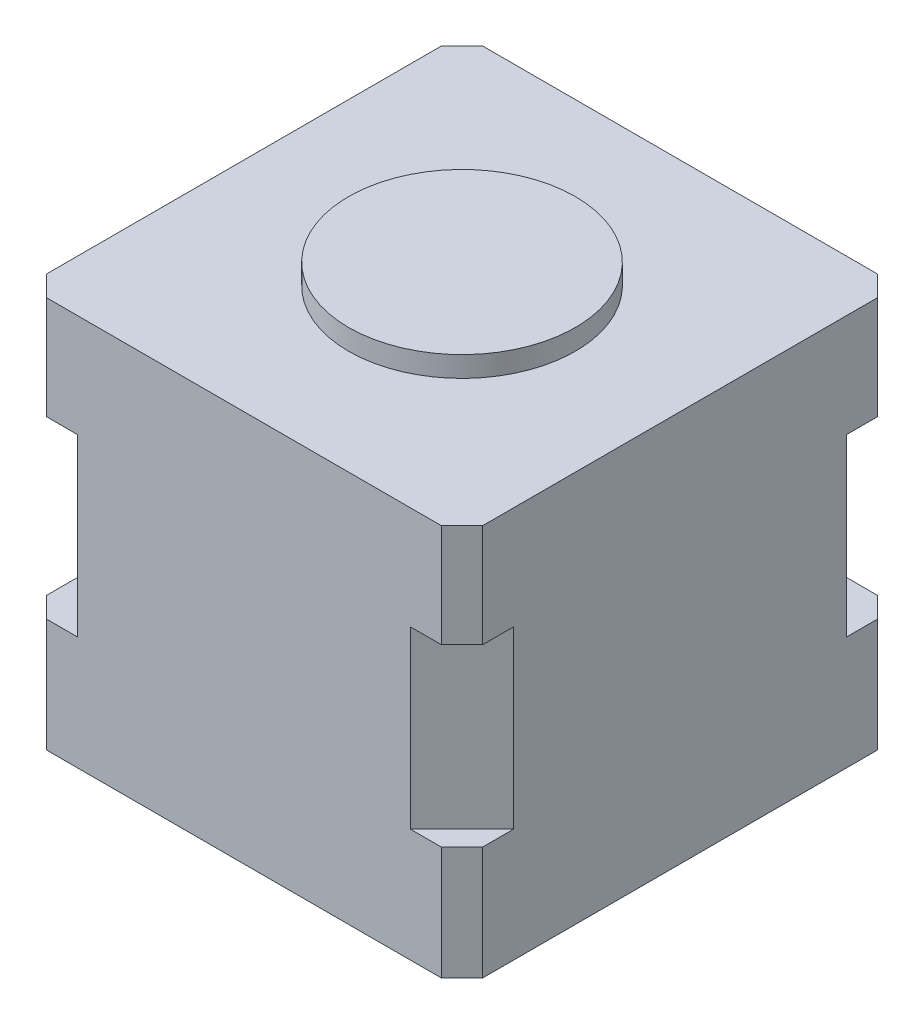
ISO-10303-21;
HEADER;
FILE_DESCRIPTION(('STEP AP214'),'2;1');
FILE_NAME('part.step','',(''),(''),'','','');
FILE_SCHEMA(('AUTOMOTIVE_DESIGN { 1 0 10303 214 1 1 1 1 }'));
ENDSEC;
DATA;
#1=APPLICATION_CONTEXT('core data for automotive mechanical design processes');
#2=APPLICATION_PROTOCOL_DEFINITION('international standard','automotive_design',2000,#1);
#3=PRODUCT_CONTEXT('',#1,'mechanical');
#4=PRODUCT('Part','Part','',(#3));
#5=PRODUCT_RELATED_PRODUCT_CATEGORY('part','',(#4));
#6=PRODUCT_DEFINITION_FORMATION('','',#4);
#7=PRODUCT_DEFINITION_CONTEXT('part definition',#1,'design');
#8=PRODUCT_DEFINITION('design','',#6,#7);
#9=PRODUCT_DEFINITION_SHAPE('','',#8);
#10=(LENGTH_UNIT() NAMED_UNIT(*) SI_UNIT(.MILLI.,.METRE.));
#11=(NAMED_UNIT(*) PLANE_ANGLE_UNIT() SI_UNIT($,.RADIAN.));
#12=(NAMED_UNIT(*) SI_UNIT($,.STERADIAN.) SOLID_ANGLE_UNIT());
#13=UNCERTAINTY_MEASURE_WITH_UNIT(LENGTH_MEASURE(1.E-05),#10,'distance_accuracy_value','');
#14=(GEOMETRIC_REPRESENTATION_CONTEXT(3) GLOBAL_UNCERTAINTY_ASSIGNED_CONTEXT((#13)) GLOBAL_UNIT_ASSIGNED_CONTEXT((#10,
#11,#12)) REPRESENTATION_CONTEXT('',''));
#15=CARTESIAN_POINT('',(0.,0.,0.));
#16=DIRECTION('',(0.,0.,1.));
#17=DIRECTION('',(1.,0.,0.));
#18=AXIS2_PLACEMENT_3D('',#15,#16,#17);
#19=CARTESIAN_POINT('',(0.,11.,0.));
#20=DIRECTION('',(0.,-1.,0.));
#21=DIRECTION('',(0.,0.,-1.));
#22=AXIS2_PLACEMENT_3D('',#19,#20,#21);
#23=PLANE('',#22);
#24=DIRECTION('',(0.707106781186548,0.,0.707106781186548));
#25=VECTOR('',#24,1.);
#26=CARTESIAN_POINT('',(-21.15,11.,16.15));
#27=LINE('',#26,#25);
#28=CARTESIAN_POINT('',(-21.15,11.,16.15));
#29=VERTEX_POINT('',#28);
#30=CARTESIAN_POINT('',(-16.15,11.,21.15));
#31=VERTEX_POINT('',#30);
#32=EDGE_CURVE('E65',#29,#31,#27,.T.);
#33=ORIENTED_EDGE('',*,*,#32,.F.);
#34=DIRECTION('',(0.,0.,1.));
#35=VECTOR('',#34,1.);
#36=CARTESIAN_POINT('',(-21.15,11.,-19.15));
#37=LINE('',#36,#35);
#38=CARTESIAN_POINT('',(-21.15,11.,19.15));
#39=VERTEX_POINT('',#38);
#40=EDGE_CURVE('E329',#29,#39,#37,.T.);
#41=ORIENTED_EDGE('',*,*,#40,.T.);
#42=DIRECTION('',(0.707106781186546,0.,0.707106781186549));
#43=VECTOR('',#42,1.);
#44=CARTESIAN_POINT('',(-21.15,11.,19.15));
#45=LINE('',#44,#43);
#46=CARTESIAN_POINT('',(-19.15,11.,21.15));
#47=VERTEX_POINT('',#46);
#48=EDGE_CURVE('E332',#39,#47,#45,.T.);
#49=ORIENTED_EDGE('',*,*,#48,.T.);
#50=DIRECTION('',(1.,0.,0.));
#51=VECTOR('',#50,1.);
#52=CARTESIAN_POINT('',(-19.15,11.,21.15));
#53=LINE('',#52,#51);
#54=EDGE_CURVE('E308',#47,#31,#53,.T.);
#55=ORIENTED_EDGE('',*,*,#54,.T.);
#56=EDGE_LOOP('',(#33,#41,#49,#55));
#57=FACE_BOUND('',#56,.T.);
#58=ADVANCED_FACE('F48',(#57),#23,.F.);
#59=DIRECTION('',(-0.707106781186548,0.,0.707106781186548));
#60=VECTOR('',#59,1.);
#61=CARTESIAN_POINT('',(-21.15,11.,-16.15));
#62=LINE('',#61,#60);
#63=CARTESIAN_POINT('',(-16.15,11.,-21.15));
#64=VERTEX_POINT('',#63);
#65=CARTESIAN_POINT('',(-21.15,11.,-16.15));
#66=VERTEX_POINT('',#65);
#67=EDGE_CURVE('E271',#64,#66,#62,.T.);
#68=ORIENTED_EDGE('',*,*,#67,.F.);
#69=DIRECTION('',(-1.,0.,0.));
#70=VECTOR('',#69,1.);
#71=CARTESIAN_POINT('',(-19.15,11.,-21.15));
#72=LINE('',#71,#70);
#73=CARTESIAN_POINT('',(-19.15,11.,-21.15));
#74=VERTEX_POINT('',#73);
#75=EDGE_CURVE('E322',#64,#74,#72,.T.);
#76=ORIENTED_EDGE('',*,*,#75,.T.);
#77=DIRECTION('',(-0.707106781186549,0.,0.707106781186546));
#78=VECTOR('',#77,1.);
#79=CARTESIAN_POINT('',(-21.15,11.,-19.15));
#80=LINE('',#79,#78);
#81=CARTESIAN_POINT('',(-21.15,11.,-19.15));
#82=VERTEX_POINT('',#81);
#83=EDGE_CURVE('E326',#74,#82,#80,.T.);
#84=ORIENTED_EDGE('',*,*,#83,.T.);
#85=EDGE_CURVE('E73',#82,#66,#37,.T.);
#86=ORIENTED_EDGE('',*,*,#85,.T.);
#87=EDGE_LOOP('',(#68,#76,#84,#86));
#88=FACE_BOUND('',#87,.T.);
#89=ADVANCED_FACE('F559',(#88),#23,.F.);
#90=DIRECTION('',(-0.707106781186547,0.,-0.707106781186548));
#91=VECTOR('',#90,1.);
#92=CARTESIAN_POINT('',(16.15,11.,-21.15));
#93=LINE('',#92,#91);
#94=CARTESIAN_POINT('',(21.15,11.,-16.15));
#95=VERTEX_POINT('',#94);
#96=CARTESIAN_POINT('',(16.15,11.,-21.15));
#97=VERTEX_POINT('',#96);
#98=EDGE_CURVE('E245',#95,#97,#93,.T.);
#99=ORIENTED_EDGE('',*,*,#98,.F.);
#100=DIRECTION('',(0.,0.,-1.));
#101=VECTOR('',#100,1.);
#102=CARTESIAN_POINT('',(21.15,11.,-19.15));
#103=LINE('',#102,#101);
#104=CARTESIAN_POINT('',(21.15,11.,-19.15));
#105=VERTEX_POINT('',#104);
#106=EDGE_CURVE('E315',#95,#105,#103,.T.);
#107=ORIENTED_EDGE('',*,*,#106,.T.);
#108=DIRECTION('',(-0.707106781186549,0.,-0.707106781186546));
#109=VECTOR('',#108,1.);
#110=CARTESIAN_POINT('',(19.15,11.,-21.15));
#111=LINE('',#110,#109);
#112=CARTESIAN_POINT('',(19.15,11.,-21.15));
#113=VERTEX_POINT('',#112);
#114=EDGE_CURVE('E319',#105,#113,#111,.T.);
#115=ORIENTED_EDGE('',*,*,#114,.T.);
#116=EDGE_CURVE('E323',#113,#97,#72,.T.);
#117=ORIENTED_EDGE('',*,*,#116,.T.);
#118=EDGE_LOOP('',(#99,#107,#115,#117));
#119=FACE_BOUND('',#118,.T.);
#120=ADVANCED_FACE('F413',(#119),#23,.F.);
#121=DIRECTION('',(0.707106781186548,0.,-0.707106781186548));
#122=VECTOR('',#121,1.);
#123=CARTESIAN_POINT('',(16.15,11.,21.15));
#124=LINE('',#123,#122);
#125=CARTESIAN_POINT('',(16.15,11.,21.15));
#126=VERTEX_POINT('',#125);
#127=CARTESIAN_POINT('',(21.15,11.,16.15));
#128=VERTEX_POINT('',#127);
#129=EDGE_CURVE('E240',#126,#128,#124,.T.);
#130=ORIENTED_EDGE('',*,*,#129,.F.);
#131=CARTESIAN_POINT('',(19.15,11.,21.15));
#132=VERTEX_POINT('',#131);
#133=EDGE_CURVE('E312',#126,#132,#53,.T.);
#134=ORIENTED_EDGE('',*,*,#133,.T.);
#135=DIRECTION('',(0.707106781186549,0.,-0.707106781186546));
#136=VECTOR('',#135,1.);
#137=CARTESIAN_POINT('',(19.15,11.,21.15));
#138=LINE('',#137,#136);
#139=CARTESIAN_POINT('',(21.15,11.,19.15));
#140=VERTEX_POINT('',#139);
#141=EDGE_CURVE('E311',#132,#140,#138,.T.);
#142=ORIENTED_EDGE('',*,*,#141,.T.);
#143=EDGE_CURVE('E316',#140,#128,#103,.T.);
#144=ORIENTED_EDGE('',*,*,#143,.T.);
#145=EDGE_LOOP('',(#130,#134,#142,#144));
#146=FACE_BOUND('',#145,.T.);
#147=ADVANCED_FACE('F417',(#146),#23,.F.);
#148=CARTESIAN_POINT('',(-19.15,11.,21.15));
#149=DIRECTION('',(0.,0.,-1.));
#150=DIRECTION('',(-1.,0.,0.));
#151=AXIS2_PLACEMENT_3D('',#148,#149,#150);
#152=PLANE('',#151);
#153=DIRECTION('',(1.,0.,0.));
#154=VECTOR('',#153,1.);
#155=CARTESIAN_POINT('',(-19.15,0.,21.15));
#156=LINE('',#155,#154);
#157=CARTESIAN_POINT('',(-19.15,0.,21.15));
#158=VERTEX_POINT('',#157);
#159=CARTESIAN_POINT('',(19.15,0.,21.15));
#160=VERTEX_POINT('',#159);
#161=EDGE_CURVE('E307',#158,#160,#156,.T.);
#162=ORIENTED_EDGE('',*,*,#161,.T.);
#163=DIRECTION('',(0.,-1.,0.));
#164=VECTOR('',#163,1.);
#165=CARTESIAN_POINT('',(19.15,11.,21.15));
#166=LINE('',#165,#164);
#167=EDGE_CURVE('E52',#132,#160,#166,.T.);
#168=ORIENTED_EDGE('',*,*,#167,.F.);
#169=ORIENTED_EDGE('',*,*,#133,.F.);
#170=DIRECTION('',(0.,-1.,0.));
#171=VECTOR('',#170,1.);
#172=CARTESIAN_POINT('',(16.15,28.,21.15));
#173=LINE('',#172,#171);
#174=CARTESIAN_POINT('',(16.15,28.,21.15));
#175=VERTEX_POINT('',#174);
#176=EDGE_CURVE('E303',#175,#126,#173,.T.);
#177=ORIENTED_EDGE('',*,*,#176,.F.);
#178=DIRECTION('',(1.,0.,0.));
#179=VECTOR('',#178,1.);
#180=CARTESIAN_POINT('',(-19.15,28.,21.15));
#181=LINE('',#180,#179);
#182=CARTESIAN_POINT('',(19.15,28.,21.15));
#183=VERTEX_POINT('',#182);
#184=EDGE_CURVE('E237',#175,#183,#181,.T.);
#185=ORIENTED_EDGE('',*,*,#184,.T.);
#186=DIRECTION('',(0.,-1.,0.));
#187=VECTOR('',#186,1.);
#188=CARTESIAN_POINT('',(19.15,38.,21.15));
#189=LINE('',#188,#187);
#190=CARTESIAN_POINT('',(19.15,38.,21.15));
#191=VERTEX_POINT('',#190);
#192=EDGE_CURVE('E215',#191,#183,#189,.T.);
#193=ORIENTED_EDGE('',*,*,#192,.F.);
#194=DIRECTION('',(1.,0.,0.));
#195=VECTOR('',#194,1.);
#196=CARTESIAN_POINT('',(-19.15,38.,21.15));
#197=LINE('',#196,#195);
#198=CARTESIAN_POINT('',(-19.15,38.,21.15));
#199=VERTEX_POINT('',#198);
#200=EDGE_CURVE('E222',#199,#191,#197,.T.);
#201=ORIENTED_EDGE('',*,*,#200,.F.);
#202=DIRECTION('',(0.,-1.,0.));
#203=VECTOR('',#202,1.);
#204=CARTESIAN_POINT('',(-19.15,38.,21.15));
#205=LINE('',#204,#203);
#206=CARTESIAN_POINT('',(-19.15,28.,21.15));
#207=VERTEX_POINT('',#206);
#208=EDGE_CURVE('E451',#199,#207,#205,.T.);
#209=ORIENTED_EDGE('',*,*,#208,.T.);
#210=CARTESIAN_POINT('',(-16.15,28.,21.15));
#211=VERTEX_POINT('',#210);
#212=EDGE_CURVE('E502',#207,#211,#181,.T.);
#213=ORIENTED_EDGE('',*,*,#212,.T.);
#214=DIRECTION('',(0.,-1.,0.));
#215=VECTOR('',#214,1.);
#216=CARTESIAN_POINT('',(-16.15,28.,21.15));
#217=LINE('',#216,#215);
#218=EDGE_CURVE('E266',#211,#31,#217,.T.);
#219=ORIENTED_EDGE('',*,*,#218,.T.);
#220=ORIENTED_EDGE('',*,*,#54,.F.);
#221=DIRECTION('',(0.,-1.,0.));
#222=VECTOR('',#221,1.);
#223=CARTESIAN_POINT('',(-19.15,11.,21.15));
#224=LINE('',#223,#222);
#225=EDGE_CURVE('E335',#47,#158,#224,.T.);
#226=ORIENTED_EDGE('',*,*,#225,.T.);
#227=EDGE_LOOP('',(#162,#168,#169,#177,#185,#193,#201,#209,#213,#219,#220,#226));
#228=FACE_BOUND('',#227,.T.);
#229=ADVANCED_FACE('F50',(#228),#152,.F.);
#230=CARTESIAN_POINT('',(19.15,11.,21.15));
#231=DIRECTION('',(-0.707106781186546,0.,-0.707106781186549));
#232=DIRECTION('',(-0.707106781186549,0.,0.707106781186546));
#233=AXIS2_PLACEMENT_3D('',#230,#231,#232);
#234=PLANE('',#233);
#235=DIRECTION('',(0.707106781186549,0.,-0.707106781186546));
#236=VECTOR('',#235,1.);
#237=CARTESIAN_POINT('',(19.15,0.,21.15));
#238=LINE('',#237,#236);
#239=CARTESIAN_POINT('',(21.15,0.,19.15));
#240=VERTEX_POINT('',#239);
#241=EDGE_CURVE('E338',#160,#240,#238,.T.);
#242=ORIENTED_EDGE('',*,*,#241,.T.);
#243=DIRECTION('',(0.,-1.,0.));
#244=VECTOR('',#243,1.);
#245=CARTESIAN_POINT('',(21.15,11.,19.15));
#246=LINE('',#245,#244);
#247=EDGE_CURVE('E381',#140,#240,#246,.T.);
#248=ORIENTED_EDGE('',*,*,#247,.F.);
#249=ORIENTED_EDGE('',*,*,#141,.F.);
#250=ORIENTED_EDGE('',*,*,#167,.T.);
#251=EDGE_LOOP('',(#242,#248,#249,#250));
#252=FACE_BOUND('',#251,.T.);
#253=ADVANCED_FACE('F393',(#252),#234,.F.);
#254=CARTESIAN_POINT('',(21.15,11.,-19.15));
#255=DIRECTION('',(-1.,0.,0.));
#256=DIRECTION('',(0.,0.,1.));
#257=AXIS2_PLACEMENT_3D('',#254,#255,#256);
#258=PLANE('',#257);
#259=DIRECTION('',(0.,0.,-1.));
#260=VECTOR('',#259,1.);
#261=CARTESIAN_POINT('',(21.15,0.,-19.15));
#262=LINE('',#261,#260);
#263=CARTESIAN_POINT('',(21.15,0.,-19.15));
#264=VERTEX_POINT('',#263);
#265=EDGE_CURVE('E341',#240,#264,#262,.T.);
#266=ORIENTED_EDGE('',*,*,#265,.T.);
#267=DIRECTION('',(0.,-1.,0.));
#268=VECTOR('',#267,1.);
#269=CARTESIAN_POINT('',(21.15,11.,-19.15));
#270=LINE('',#269,#268);
#271=EDGE_CURVE('E378',#105,#264,#270,.T.);
#272=ORIENTED_EDGE('',*,*,#271,.F.);
#273=ORIENTED_EDGE('',*,*,#106,.F.);
#274=DIRECTION('',(0.,-1.,0.));
#275=VECTOR('',#274,1.);
#276=CARTESIAN_POINT('',(21.15,28.,-16.15));
#277=LINE('',#276,#275);
#278=CARTESIAN_POINT('',(21.15,28.,-16.15));
#279=VERTEX_POINT('',#278);
#280=EDGE_CURVE('E295',#279,#95,#277,.T.);
#281=ORIENTED_EDGE('',*,*,#280,.F.);
#282=DIRECTION('',(0.,0.,-1.));
#283=VECTOR('',#282,1.);
#284=CARTESIAN_POINT('',(21.15,28.,-19.15));
#285=LINE('',#284,#283);
#286=CARTESIAN_POINT('',(21.15,28.,-19.15));
#287=VERTEX_POINT('',#286);
#288=EDGE_CURVE('E427',#279,#287,#285,.T.);
#289=ORIENTED_EDGE('',*,*,#288,.T.);
#290=DIRECTION('',(0.,-1.,0.));
#291=VECTOR('',#290,1.);
#292=CARTESIAN_POINT('',(21.15,38.,-19.15));
#293=LINE('',#292,#291);
#294=CARTESIAN_POINT('',(21.15,38.,-19.15));
#295=VERTEX_POINT('',#294);
#296=EDGE_CURVE('E247',#295,#287,#293,.T.);
#297=ORIENTED_EDGE('',*,*,#296,.F.);
#298=DIRECTION('',(0.,0.,-1.));
#299=VECTOR('',#298,1.);
#300=CARTESIAN_POINT('',(21.15,38.,-19.15));
#301=LINE('',#300,#299);
#302=CARTESIAN_POINT('',(21.15,38.,19.15));
#303=VERTEX_POINT('',#302);
#304=EDGE_CURVE('E221',#303,#295,#301,.T.);
#305=ORIENTED_EDGE('',*,*,#304,.F.);
#306=DIRECTION('',(0.,-1.,0.));
#307=VECTOR('',#306,1.);
#308=CARTESIAN_POINT('',(21.15,38.,19.15));
#309=LINE('',#308,#307);
#310=CARTESIAN_POINT('',(21.15,28.,19.15));
#311=VERTEX_POINT('',#310);
#312=EDGE_CURVE('E217',#303,#311,#309,.T.);
#313=ORIENTED_EDGE('',*,*,#312,.T.);
#314=CARTESIAN_POINT('',(21.15,28.,16.15));
#315=VERTEX_POINT('',#314);
#316=EDGE_CURVE('E424',#311,#315,#285,.T.);
#317=ORIENTED_EDGE('',*,*,#316,.T.);
#318=DIRECTION('',(0.,-1.,0.));
#319=VECTOR('',#318,1.);
#320=CARTESIAN_POINT('',(21.15,28.,16.15));
#321=LINE('',#320,#319);
#322=EDGE_CURVE('E299',#315,#128,#321,.T.);
#323=ORIENTED_EDGE('',*,*,#322,.T.);
#324=ORIENTED_EDGE('',*,*,#143,.F.);
#325=ORIENTED_EDGE('',*,*,#247,.T.);
#326=EDGE_LOOP('',(#266,#272,#273,#281,#289,#297,#305,#313,#317,#323,#324,#325));
#327=FACE_BOUND('',#326,.T.);
#328=ADVANCED_FACE('F405',(#327),#258,.F.);
#329=CARTESIAN_POINT('',(19.15,11.,-21.15));
#330=DIRECTION('',(-0.707106781186546,0.,0.707106781186549));
#331=DIRECTION('',(0.707106781186549,0.,0.707106781186546));
#332=AXIS2_PLACEMENT_3D('',#329,#330,#331);
#333=PLANE('',#332);
#334=DIRECTION('',(-0.707106781186549,0.,-0.707106781186546));
#335=VECTOR('',#334,1.);
#336=CARTESIAN_POINT('',(19.15,0.,-21.15));
#337=LINE('',#336,#335);
#338=CARTESIAN_POINT('',(19.15,0.,-21.15));
#339=VERTEX_POINT('',#338);
#340=EDGE_CURVE('E344',#264,#339,#337,.T.);
#341=ORIENTED_EDGE('',*,*,#340,.T.);
#342=DIRECTION('',(0.,-1.,0.));
#343=VECTOR('',#342,1.);
#344=CARTESIAN_POINT('',(19.15,11.,-21.15));
#345=LINE('',#344,#343);
#346=EDGE_CURVE('E374',#113,#339,#345,.T.);
#347=ORIENTED_EDGE('',*,*,#346,.F.);
#348=ORIENTED_EDGE('',*,*,#114,.F.);
#349=ORIENTED_EDGE('',*,*,#271,.T.);
#350=EDGE_LOOP('',(#341,#347,#348,#349));
#351=FACE_BOUND('',#350,.T.);
#352=ADVANCED_FACE('F409',(#351),#333,.F.);
#353=CARTESIAN_POINT('',(-19.15,11.,-21.15));
#354=DIRECTION('',(0.,0.,1.));
#355=DIRECTION('',(1.,0.,0.));
#356=AXIS2_PLACEMENT_3D('',#353,#354,#355);
#357=PLANE('',#356);
#358=DIRECTION('',(-1.,0.,0.));
#359=VECTOR('',#358,1.);
#360=CARTESIAN_POINT('',(-19.15,0.,-21.15));
#361=LINE('',#360,#359);
#362=CARTESIAN_POINT('',(-19.15,0.,-21.15));
#363=VERTEX_POINT('',#362);
#364=EDGE_CURVE('E347',#339,#363,#361,.T.);
#365=ORIENTED_EDGE('',*,*,#364,.T.);
#366=DIRECTION('',(0.,-1.,0.));
#367=VECTOR('',#366,1.);
#368=CARTESIAN_POINT('',(-19.15,11.,-21.15));
#369=LINE('',#368,#367);
#370=EDGE_CURVE('E370',#74,#363,#369,.T.);
#371=ORIENTED_EDGE('',*,*,#370,.F.);
#372=ORIENTED_EDGE('',*,*,#75,.F.);
#373=DIRECTION('',(0.,-1.,0.));
#374=VECTOR('',#373,1.);
#375=CARTESIAN_POINT('',(-16.15,28.,-21.15));
#376=LINE('',#375,#374);
#377=CARTESIAN_POINT('',(-16.15,28.,-21.15));
#378=VERTEX_POINT('',#377);
#379=EDGE_CURVE('E287',#378,#64,#376,.T.);
#380=ORIENTED_EDGE('',*,*,#379,.F.);
#381=DIRECTION('',(-1.,0.,0.));
#382=VECTOR('',#381,1.);
#383=CARTESIAN_POINT('',(-19.15,28.,-21.15));
#384=LINE('',#383,#382);
#385=CARTESIAN_POINT('',(-19.15,28.,-21.15));
#386=VERTEX_POINT('',#385);
#387=EDGE_CURVE('E431',#378,#386,#384,.T.);
#388=ORIENTED_EDGE('',*,*,#387,.T.);
#389=DIRECTION('',(0.,-1.,0.));
#390=VECTOR('',#389,1.);
#391=CARTESIAN_POINT('',(-19.15,38.,-21.15));
#392=LINE('',#391,#390);
#393=CARTESIAN_POINT('',(-19.15,38.,-21.15));
#394=VERTEX_POINT('',#393);
#395=EDGE_CURVE('E462',#394,#386,#392,.T.);
#396=ORIENTED_EDGE('',*,*,#395,.F.);
#397=DIRECTION('',(-1.,0.,0.));
#398=VECTOR('',#397,1.);
#399=CARTESIAN_POINT('',(-19.15,38.,-21.15));
#400=LINE('',#399,#398);
#401=CARTESIAN_POINT('',(19.15,38.,-21.15));
#402=VERTEX_POINT('',#401);
#403=EDGE_CURVE('E487',#402,#394,#400,.T.);
#404=ORIENTED_EDGE('',*,*,#403,.F.);
#405=DIRECTION('',(0.,-1.,0.));
#406=VECTOR('',#405,1.);
#407=CARTESIAN_POINT('',(19.15,38.,-21.15));
#408=LINE('',#407,#406);
#409=CARTESIAN_POINT('',(19.15,28.,-21.15));
#410=VERTEX_POINT('',#409);
#411=EDGE_CURVE('E466',#402,#410,#408,.T.);
#412=ORIENTED_EDGE('',*,*,#411,.T.);
#413=CARTESIAN_POINT('',(16.15,28.,-21.15));
#414=VERTEX_POINT('',#413);
#415=EDGE_CURVE('E437',#410,#414,#384,.T.);
#416=ORIENTED_EDGE('',*,*,#415,.T.);
#417=DIRECTION('',(0.,-1.,0.));
#418=VECTOR('',#417,1.);
#419=CARTESIAN_POINT('',(16.15,28.,-21.15));
#420=LINE('',#419,#418);
#421=EDGE_CURVE('E291',#414,#97,#420,.T.);
#422=ORIENTED_EDGE('',*,*,#421,.T.);
#423=ORIENTED_EDGE('',*,*,#116,.F.);
#424=ORIENTED_EDGE('',*,*,#346,.T.);
#425=EDGE_LOOP('',(#365,#371,#372,#380,#388,#396,#404,#412,#416,#422,#423,#424));
#426=FACE_BOUND('',#425,.T.);
#427=ADVANCED_FACE('F484',(#426),#357,.F.);
#428=CARTESIAN_POINT('',(-21.15,11.,-19.15));
#429=DIRECTION('',(0.707106781186546,0.,0.707106781186549));
#430=DIRECTION('',(0.707106781186549,0.,-0.707106781186546));
#431=AXIS2_PLACEMENT_3D('',#428,#429,#430);
#432=PLANE('',#431);
#433=DIRECTION('',(-0.707106781186549,0.,0.707106781186546));
#434=VECTOR('',#433,1.);
#435=CARTESIAN_POINT('',(-21.15,0.,-19.15));
#436=LINE('',#435,#434);
#437=CARTESIAN_POINT('',(-21.15,0.,-19.15));
#438=VERTEX_POINT('',#437);
#439=EDGE_CURVE('E350',#363,#438,#436,.T.);
#440=ORIENTED_EDGE('',*,*,#439,.T.);
#441=DIRECTION('',(0.,-1.,0.));
#442=VECTOR('',#441,1.);
#443=CARTESIAN_POINT('',(-21.15,11.,-19.15));
#444=LINE('',#443,#442);
#445=EDGE_CURVE('E366',#82,#438,#444,.T.);
#446=ORIENTED_EDGE('',*,*,#445,.F.);
#447=ORIENTED_EDGE('',*,*,#83,.F.);
#448=ORIENTED_EDGE('',*,*,#370,.T.);
#449=EDGE_LOOP('',(#440,#446,#447,#448));
#450=FACE_BOUND('',#449,.T.);
#451=ADVANCED_FACE('F553',(#450),#432,.F.);
#452=CARTESIAN_POINT('',(-21.15,11.,-19.15));
#453=DIRECTION('',(1.,0.,0.));
#454=DIRECTION('',(0.,0.,-1.));
#455=AXIS2_PLACEMENT_3D('',#452,#453,#454);
#456=PLANE('',#455);
#457=DIRECTION('',(0.,0.,1.));
#458=VECTOR('',#457,1.);
#459=CARTESIAN_POINT('',(-21.15,0.,-19.15));
#460=LINE('',#459,#458);
#461=CARTESIAN_POINT('',(-21.15,0.,19.15));
#462=VERTEX_POINT('',#461);
#463=EDGE_CURVE('E353',#438,#462,#460,.T.);
#464=ORIENTED_EDGE('',*,*,#463,.T.);
#465=DIRECTION('',(0.,-1.,0.));
#466=VECTOR('',#465,1.);
#467=CARTESIAN_POINT('',(-21.15,11.,19.15));
#468=LINE('',#467,#466);
#469=EDGE_CURVE('E362',#39,#462,#468,.T.);
#470=ORIENTED_EDGE('',*,*,#469,.F.);
#471=ORIENTED_EDGE('',*,*,#40,.F.);
#472=DIRECTION('',(0.,-1.,0.));
#473=VECTOR('',#472,1.);
#474=CARTESIAN_POINT('',(-21.15,28.,16.15));
#475=LINE('',#474,#473);
#476=CARTESIAN_POINT('',(-21.15,28.,16.15));
#477=VERTEX_POINT('',#476);
#478=EDGE_CURVE('E279',#477,#29,#475,.T.);
#479=ORIENTED_EDGE('',*,*,#478,.F.);
#480=DIRECTION('',(0.,0.,1.));
#481=VECTOR('',#480,1.);
#482=CARTESIAN_POINT('',(-21.15,28.,-19.15));
#483=LINE('',#482,#481);
#484=CARTESIAN_POINT('',(-21.15,28.,19.15));
#485=VERTEX_POINT('',#484);
#486=EDGE_CURVE('E444',#477,#485,#483,.T.);
#487=ORIENTED_EDGE('',*,*,#486,.T.);
#488=DIRECTION('',(0.,-1.,0.));
#489=VECTOR('',#488,1.);
#490=CARTESIAN_POINT('',(-21.15,38.,19.15));
#491=LINE('',#490,#489);
#492=CARTESIAN_POINT('',(-21.15,38.,19.15));
#493=VERTEX_POINT('',#492);
#494=EDGE_CURVE('E454',#493,#485,#491,.T.);
#495=ORIENTED_EDGE('',*,*,#494,.F.);
#496=DIRECTION('',(0.,0.,1.));
#497=VECTOR('',#496,1.);
#498=CARTESIAN_POINT('',(-21.15,38.,-19.15));
#499=LINE('',#498,#497);
#500=CARTESIAN_POINT('',(-21.15,38.,-19.15));
#501=VERTEX_POINT('',#500);
#502=EDGE_CURVE('E494',#501,#493,#499,.T.);
#503=ORIENTED_EDGE('',*,*,#502,.F.);
#504=DIRECTION('',(0.,-1.,0.));
#505=VECTOR('',#504,1.);
#506=CARTESIAN_POINT('',(-21.15,38.,-19.15));
#507=LINE('',#506,#505);
#508=CARTESIAN_POINT('',(-21.15,28.,-19.15));
#509=VERTEX_POINT('',#508);
#510=EDGE_CURVE('E458',#501,#509,#507,.T.);
#511=ORIENTED_EDGE('',*,*,#510,.T.);
#512=CARTESIAN_POINT('',(-21.15,28.,-16.15));
#513=VERTEX_POINT('',#512);
#514=EDGE_CURVE('E445',#509,#513,#483,.T.);
#515=ORIENTED_EDGE('',*,*,#514,.T.);
#516=DIRECTION('',(0.,-1.,0.));
#517=VECTOR('',#516,1.);
#518=CARTESIAN_POINT('',(-21.15,28.,-16.15));
#519=LINE('',#518,#517);
#520=EDGE_CURVE('E283',#513,#66,#519,.T.);
#521=ORIENTED_EDGE('',*,*,#520,.T.);
#522=ORIENTED_EDGE('',*,*,#85,.F.);
#523=ORIENTED_EDGE('',*,*,#445,.T.);
#524=EDGE_LOOP('',(#464,#470,#471,#479,#487,#495,#503,#511,#515,#521,#522,#523));
#525=FACE_BOUND('',#524,.T.);
#526=ADVANCED_FACE('F534',(#525),#456,.F.);
#527=CARTESIAN_POINT('',(-21.15,11.,19.15));
#528=DIRECTION('',(0.707106781186549,0.,-0.707106781186546));
#529=DIRECTION('',(-0.707106781186546,0.,-0.707106781186549));
#530=AXIS2_PLACEMENT_3D('',#527,#528,#529);
#531=PLANE('',#530);
#532=DIRECTION('',(0.707106781186546,0.,0.707106781186549));
#533=VECTOR('',#532,1.);
#534=CARTESIAN_POINT('',(-21.15,0.,19.15));
#535=LINE('',#534,#533);
#536=EDGE_CURVE('E356',#462,#158,#535,.T.);
#537=ORIENTED_EDGE('',*,*,#536,.T.);
#538=ORIENTED_EDGE('',*,*,#225,.F.);
#539=ORIENTED_EDGE('',*,*,#48,.F.);
#540=ORIENTED_EDGE('',*,*,#469,.T.);
#541=EDGE_LOOP('',(#537,#538,#539,#540));
#542=FACE_BOUND('',#541,.T.);
#543=ADVANCED_FACE('F549',(#542),#531,.F.);
#544=CARTESIAN_POINT('',(0.,0.,0.));
#545=DIRECTION('',(0.,-1.,0.));
#546=DIRECTION('',(0.,0.,-1.));
#547=AXIS2_PLACEMENT_3D('',#544,#545,#546);
#548=PLANE('',#547);
#549=CARTESIAN_POINT('',(-15.5,0.,-15.5));
#550=DIRECTION('',(0.,-1.,0.));
#551=DIRECTION('',(0.,0.,-1.));
#552=AXIS2_PLACEMENT_3D('',#549,#550,#551);
#553=CIRCLE('',#552,1.5);
#554=CARTESIAN_POINT('',(-15.5,0.,-17.));
#555=VERTEX_POINT('',#554);
#556=EDGE_CURVE('E907',#555,#555,#553,.T.);
#557=ORIENTED_EDGE('',*,*,#556,.F.);
#558=EDGE_LOOP('',(#557));
#559=FACE_BOUND('',#558,.T.);
#560=CARTESIAN_POINT('',(15.5,0.,-15.5));
#561=DIRECTION('',(0.,-1.,0.));
#562=DIRECTION('',(0.,0.,-1.));
#563=AXIS2_PLACEMENT_3D('',#560,#561,#562);
#564=CIRCLE('',#563,1.5);
#565=CARTESIAN_POINT('',(15.5,0.,-17.));
#566=VERTEX_POINT('',#565);
#567=EDGE_CURVE('E917',#566,#566,#564,.T.);
#568=ORIENTED_EDGE('',*,*,#567,.F.);
#569=EDGE_LOOP('',(#568));
#570=FACE_BOUND('',#569,.T.);
#571=CARTESIAN_POINT('',(15.5,0.,15.5));
#572=DIRECTION('',(0.,-1.,0.));
#573=DIRECTION('',(0.,0.,-1.));
#574=AXIS2_PLACEMENT_3D('',#571,#572,#573);
#575=CIRCLE('',#574,1.5);
#576=CARTESIAN_POINT('',(15.5,0.,14.));
#577=VERTEX_POINT('',#576);
#578=EDGE_CURVE('E925',#577,#577,#575,.T.);
#579=ORIENTED_EDGE('',*,*,#578,.F.);
#580=EDGE_LOOP('',(#579));
#581=FACE_BOUND('',#580,.T.);
#582=CARTESIAN_POINT('',(-15.5,0.,15.5));
#583=DIRECTION('',(0.,-1.,0.));
#584=DIRECTION('',(0.,0.,-1.));
#585=AXIS2_PLACEMENT_3D('',#582,#583,#584);
#586=CIRCLE('',#585,1.5);
#587=CARTESIAN_POINT('',(-15.5,0.,14.));
#588=VERTEX_POINT('',#587);
#589=EDGE_CURVE('E517',#588,#588,#586,.T.);
#590=ORIENTED_EDGE('',*,*,#589,.F.);
#591=EDGE_LOOP('',(#590));
#592=FACE_BOUND('',#591,.T.);
#593=ORIENTED_EDGE('',*,*,#161,.F.);
#594=ORIENTED_EDGE('',*,*,#536,.F.);
#595=ORIENTED_EDGE('',*,*,#463,.F.);
#596=ORIENTED_EDGE('',*,*,#439,.F.);
#597=ORIENTED_EDGE('',*,*,#364,.F.);
#598=ORIENTED_EDGE('',*,*,#340,.F.);
#599=ORIENTED_EDGE('',*,*,#265,.F.);
#600=ORIENTED_EDGE('',*,*,#241,.F.);
#601=EDGE_LOOP('',(#593,#594,#595,#596,#597,#598,#599,#600));
#602=FACE_BOUND('',#601,.T.);
#603=ADVANCED_FACE('F400',(#559,#570,#581,#592,#602),#548,.T.);
#604=CARTESIAN_POINT('',(16.15,28.,21.15));
#605=DIRECTION('',(-0.707106781186547,0.,-0.707106781186547));
#606=DIRECTION('',(-0.707106781186548,0.,0.707106781186548));
#607=AXIS2_PLACEMENT_3D('',#604,#605,#606);
#608=PLANE('',#607);
#609=ORIENTED_EDGE('',*,*,#129,.T.);
#610=ORIENTED_EDGE('',*,*,#322,.F.);
#611=DIRECTION('',(0.707106781186548,0.,-0.707106781186548));
#612=VECTOR('',#611,1.);
#613=CARTESIAN_POINT('',(16.15,28.,21.15));
#614=LINE('',#613,#612);
#615=EDGE_CURVE('E251',#175,#315,#614,.T.);
#616=ORIENTED_EDGE('',*,*,#615,.F.);
#617=ORIENTED_EDGE('',*,*,#176,.T.);
#618=EDGE_LOOP('',(#609,#610,#616,#617));
#619=FACE_BOUND('',#618,.T.);
#620=ADVANCED_FACE('F419',(#619),#608,.F.);
#621=CARTESIAN_POINT('',(16.15,28.,-21.15));
#622=DIRECTION('',(-0.707106781186548,0.,0.707106781186547));
#623=DIRECTION('',(0.707106781186547,0.,0.707106781186548));
#624=AXIS2_PLACEMENT_3D('',#621,#622,#623);
#625=PLANE('',#624);
#626=ORIENTED_EDGE('',*,*,#98,.T.);
#627=ORIENTED_EDGE('',*,*,#421,.F.);
#628=DIRECTION('',(-0.707106781186547,0.,-0.707106781186548));
#629=VECTOR('',#628,1.);
#630=CARTESIAN_POINT('',(16.15,28.,-21.15));
#631=LINE('',#630,#629);
#632=EDGE_CURVE('E255',#279,#414,#631,.T.);
#633=ORIENTED_EDGE('',*,*,#632,.F.);
#634=ORIENTED_EDGE('',*,*,#280,.T.);
#635=EDGE_LOOP('',(#626,#627,#633,#634));
#636=FACE_BOUND('',#635,.T.);
#637=ADVANCED_FACE('F617',(#636),#625,.F.);
#638=CARTESIAN_POINT('',(-21.15,28.,-16.15));
#639=DIRECTION('',(0.707106781186547,0.,0.707106781186547));
#640=DIRECTION('',(0.707106781186548,0.,-0.707106781186548));
#641=AXIS2_PLACEMENT_3D('',#638,#639,#640);
#642=PLANE('',#641);
#643=ORIENTED_EDGE('',*,*,#67,.T.);
#644=ORIENTED_EDGE('',*,*,#520,.F.);
#645=DIRECTION('',(-0.707106781186548,0.,0.707106781186548));
#646=VECTOR('',#645,1.);
#647=CARTESIAN_POINT('',(-21.15,28.,-16.15));
#648=LINE('',#647,#646);
#649=EDGE_CURVE('E259',#378,#513,#648,.T.);
#650=ORIENTED_EDGE('',*,*,#649,.F.);
#651=ORIENTED_EDGE('',*,*,#379,.T.);
#652=EDGE_LOOP('',(#643,#644,#650,#651));
#653=FACE_BOUND('',#652,.T.);
#654=ADVANCED_FACE('F558',(#653),#642,.F.);
#655=CARTESIAN_POINT('',(-21.15,28.,16.15));
#656=DIRECTION('',(0.707106781186547,0.,-0.707106781186547));
#657=DIRECTION('',(-0.707106781186548,0.,-0.707106781186548));
#658=AXIS2_PLACEMENT_3D('',#655,#656,#657);
#659=PLANE('',#658);
#660=ORIENTED_EDGE('',*,*,#32,.T.);
#661=ORIENTED_EDGE('',*,*,#218,.F.);
#662=DIRECTION('',(0.707106781186548,0.,0.707106781186548));
#663=VECTOR('',#662,1.);
#664=CARTESIAN_POINT('',(-21.15,28.,16.15));
#665=LINE('',#664,#663);
#666=EDGE_CURVE('E263',#477,#211,#665,.T.);
#667=ORIENTED_EDGE('',*,*,#666,.F.);
#668=ORIENTED_EDGE('',*,*,#478,.T.);
#669=EDGE_LOOP('',(#660,#661,#667,#668));
#670=FACE_BOUND('',#669,.T.);
#671=ADVANCED_FACE('F545',(#670),#659,.F.);
#672=CARTESIAN_POINT('',(0.,28.,0.));
#673=DIRECTION('',(0.,-1.,0.));
#674=DIRECTION('',(0.,0.,-1.));
#675=AXIS2_PLACEMENT_3D('',#672,#673,#674);
#676=PLANE('',#675);
#677=ORIENTED_EDGE('',*,*,#184,.F.);
#678=ORIENTED_EDGE('',*,*,#615,.T.);
#679=ORIENTED_EDGE('',*,*,#316,.F.);
#680=DIRECTION('',(0.707106781186547,0.,-0.707106781186548));
#681=VECTOR('',#680,1.);
#682=CARTESIAN_POINT('',(19.15,28.,21.15));
#683=LINE('',#682,#681);
#684=EDGE_CURVE('E433',#183,#311,#683,.T.);
#685=ORIENTED_EDGE('',*,*,#684,.F.);
#686=EDGE_LOOP('',(#677,#678,#679,#685));
#687=FACE_BOUND('',#686,.T.);
#688=ADVANCED_FACE('F423',(#687),#676,.T.);
#689=ORIENTED_EDGE('',*,*,#288,.F.);
#690=ORIENTED_EDGE('',*,*,#632,.T.);
#691=ORIENTED_EDGE('',*,*,#415,.F.);
#692=DIRECTION('',(-0.707106781186547,0.,-0.707106781186547));
#693=VECTOR('',#692,1.);
#694=CARTESIAN_POINT('',(19.15,28.,-21.15));
#695=LINE('',#694,#693);
#696=EDGE_CURVE('E426',#287,#410,#695,.T.);
#697=ORIENTED_EDGE('',*,*,#696,.F.);
#698=EDGE_LOOP('',(#689,#690,#691,#697));
#699=FACE_BOUND('',#698,.T.);
#700=ADVANCED_FACE('F481',(#699),#676,.T.);
#701=ORIENTED_EDGE('',*,*,#387,.F.);
#702=ORIENTED_EDGE('',*,*,#649,.T.);
#703=ORIENTED_EDGE('',*,*,#514,.F.);
#704=DIRECTION('',(-0.707106781186547,0.,0.707106781186548));
#705=VECTOR('',#704,1.);
#706=CARTESIAN_POINT('',(-21.15,28.,-19.15));
#707=LINE('',#706,#705);
#708=EDGE_CURVE('E441',#386,#509,#707,.T.);
#709=ORIENTED_EDGE('',*,*,#708,.F.);
#710=EDGE_LOOP('',(#701,#702,#703,#709));
#711=FACE_BOUND('',#710,.T.);
#712=ADVANCED_FACE('F532',(#711),#676,.T.);
#713=CARTESIAN_POINT('',(19.15,38.,21.15));
#714=DIRECTION('',(-0.707106781186548,0.,-0.707106781186547));
#715=DIRECTION('',(-0.707106781186547,0.,0.707106781186548));
#716=AXIS2_PLACEMENT_3D('',#713,#714,#715);
#717=PLANE('',#716);
#718=ORIENTED_EDGE('',*,*,#684,.T.);
#719=ORIENTED_EDGE('',*,*,#312,.F.);
#720=DIRECTION('',(0.707106781186547,0.,-0.707106781186548));
#721=VECTOR('',#720,1.);
#722=CARTESIAN_POINT('',(19.15,38.,21.15));
#723=LINE('',#722,#721);
#724=EDGE_CURVE('E211',#191,#303,#723,.T.);
#725=ORIENTED_EDGE('',*,*,#724,.F.);
#726=ORIENTED_EDGE('',*,*,#192,.T.);
#727=EDGE_LOOP('',(#718,#719,#725,#726));
#728=FACE_BOUND('',#727,.T.);
#729=ADVANCED_FACE('F213',(#728),#717,.F.);
#730=CARTESIAN_POINT('',(19.15,38.,-21.15));
#731=DIRECTION('',(-0.707106781186548,0.,0.707106781186548));
#732=DIRECTION('',(0.707106781186548,0.,0.707106781186548));
#733=AXIS2_PLACEMENT_3D('',#730,#731,#732);
#734=PLANE('',#733);
#735=ORIENTED_EDGE('',*,*,#696,.T.);
#736=ORIENTED_EDGE('',*,*,#411,.F.);
#737=DIRECTION('',(-0.707106781186547,0.,-0.707106781186547));
#738=VECTOR('',#737,1.);
#739=CARTESIAN_POINT('',(19.15,38.,-21.15));
#740=LINE('',#739,#738);
#741=EDGE_CURVE('E477',#295,#402,#740,.T.);
#742=ORIENTED_EDGE('',*,*,#741,.F.);
#743=ORIENTED_EDGE('',*,*,#296,.T.);
#744=EDGE_LOOP('',(#735,#736,#742,#743));
#745=FACE_BOUND('',#744,.T.);
#746=ADVANCED_FACE('F475',(#745),#734,.F.);
#747=CARTESIAN_POINT('',(-21.15,38.,-19.15));
#748=DIRECTION('',(0.707106781186548,0.,0.707106781186547));
#749=DIRECTION('',(0.707106781186547,0.,-0.707106781186548));
#750=AXIS2_PLACEMENT_3D('',#747,#748,#749);
#751=PLANE('',#750);
#752=ORIENTED_EDGE('',*,*,#708,.T.);
#753=ORIENTED_EDGE('',*,*,#510,.F.);
#754=DIRECTION('',(-0.707106781186547,0.,0.707106781186548));
#755=VECTOR('',#754,1.);
#756=CARTESIAN_POINT('',(-21.15,38.,-19.15));
#757=LINE('',#756,#755);
#758=EDGE_CURVE('E490',#394,#501,#757,.T.);
#759=ORIENTED_EDGE('',*,*,#758,.F.);
#760=ORIENTED_EDGE('',*,*,#395,.T.);
#761=EDGE_LOOP('',(#752,#753,#759,#760));
#762=FACE_BOUND('',#761,.T.);
#763=ADVANCED_FACE('F529',(#762),#751,.F.);
#764=CARTESIAN_POINT('',(-21.15,38.,19.15));
#765=DIRECTION('',(0.707106781186548,0.,-0.707106781186547));
#766=DIRECTION('',(-0.707106781186547,0.,-0.707106781186548));
#767=AXIS2_PLACEMENT_3D('',#764,#765,#766);
#768=PLANE('',#767);
#769=DIRECTION('',(0.707106781186547,0.,0.707106781186548));
#770=VECTOR('',#769,1.);
#771=CARTESIAN_POINT('',(-21.15,28.,19.15));
#772=LINE('',#771,#770);
#773=EDGE_CURVE('E232',#485,#207,#772,.T.);
#774=ORIENTED_EDGE('',*,*,#773,.T.);
#775=ORIENTED_EDGE('',*,*,#208,.F.);
#776=DIRECTION('',(0.707106781186547,0.,0.707106781186548));
#777=VECTOR('',#776,1.);
#778=CARTESIAN_POINT('',(-21.15,38.,19.15));
#779=LINE('',#778,#777);
#780=EDGE_CURVE('E227',#493,#199,#779,.T.);
#781=ORIENTED_EDGE('',*,*,#780,.F.);
#782=ORIENTED_EDGE('',*,*,#494,.T.);
#783=EDGE_LOOP('',(#774,#775,#781,#782));
#784=FACE_BOUND('',#783,.T.);
#785=ADVANCED_FACE('F540',(#784),#768,.F.);
#786=CARTESIAN_POINT('',(0.,38.,0.));
#787=DIRECTION('',(0.,-1.,0.));
#788=DIRECTION('',(0.,0.,-1.));
#789=AXIS2_PLACEMENT_3D('',#786,#787,#788);
#790=PLANE('',#789);
#791=CARTESIAN_POINT('',(0.,38.,0.));
#792=DIRECTION('',(0.,1.,0.));
#793=DIRECTION('',(0.,0.,1.));
#794=AXIS2_PLACEMENT_3D('',#791,#792,#793);
#795=CIRCLE('',#794,11.);
#796=CARTESIAN_POINT('',(0.,38.,11.));
#797=VERTEX_POINT('',#796);
#798=EDGE_CURVE('E11',#797,#797,#795,.T.);
#799=ORIENTED_EDGE('',*,*,#798,.F.);
#800=EDGE_LOOP('',(#799));
#801=FACE_BOUND('',#800,.T.);
#802=ORIENTED_EDGE('',*,*,#200,.T.);
#803=ORIENTED_EDGE('',*,*,#724,.T.);
#804=ORIENTED_EDGE('',*,*,#304,.T.);
#805=ORIENTED_EDGE('',*,*,#741,.T.);
#806=ORIENTED_EDGE('',*,*,#403,.T.);
#807=ORIENTED_EDGE('',*,*,#758,.T.);
#808=ORIENTED_EDGE('',*,*,#502,.T.);
#809=ORIENTED_EDGE('',*,*,#780,.T.);
#810=EDGE_LOOP('',(#802,#803,#804,#805,#806,#807,#808,#809));
#811=FACE_BOUND('',#810,.T.);
#812=ADVANCED_FACE('F225',(#801,#811),#790,.F.);
#813=ORIENTED_EDGE('',*,*,#486,.F.);
#814=ORIENTED_EDGE('',*,*,#666,.T.);
#815=ORIENTED_EDGE('',*,*,#212,.F.);
#816=ORIENTED_EDGE('',*,*,#773,.F.);
#817=EDGE_LOOP('',(#813,#814,#815,#816));
#818=FACE_BOUND('',#817,.T.);
#819=ADVANCED_FACE('F542',(#818),#676,.T.);
#820=CARTESIAN_POINT('',(0.,40.,0.));
#821=DIRECTION('',(0.,-1.,0.));
#822=DIRECTION('',(0.,0.,-1.));
#823=AXIS2_PLACEMENT_3D('',#820,#821,#822);
#824=CYLINDRICAL_SURFACE('',#823,11.);
#825=CARTESIAN_POINT('',(0.,40.,0.));
#826=DIRECTION('',(0.,1.,0.));
#827=DIRECTION('',(0.,0.,1.));
#828=AXIS2_PLACEMENT_3D('',#825,#826,#827);
#829=CIRCLE('',#828,11.);
#830=CARTESIAN_POINT('',(0.,40.,11.));
#831=VERTEX_POINT('',#830);
#832=EDGE_CURVE('E508',#831,#831,#829,.T.);
#833=ORIENTED_EDGE('',*,*,#832,.F.);
#834=EDGE_LOOP('',(#833));
#835=FACE_BOUND('',#834,.T.);
#836=ORIENTED_EDGE('',*,*,#798,.T.);
#837=EDGE_LOOP('',(#836));
#838=FACE_BOUND('',#837,.T.);
#839=ADVANCED_FACE('F706',(#835,#838),#824,.T.);
#840=CARTESIAN_POINT('',(0.,40.,0.));
#841=DIRECTION('',(0.,1.,0.));
#842=DIRECTION('',(0.,0.,1.));
#843=AXIS2_PLACEMENT_3D('',#840,#841,#842);
#844=PLANE('',#843);
#845=ORIENTED_EDGE('',*,*,#832,.T.);
#846=EDGE_LOOP('',(#845));
#847=FACE_BOUND('',#846,.T.);
#848=ADVANCED_FACE('F713',(#847),#844,.T.);
#849=CARTESIAN_POINT('',(-15.5,4.5,15.5));
#850=DIRECTION('',(0.,-1.,0.));
#851=DIRECTION('',(0.,0.,-1.));
#852=AXIS2_PLACEMENT_3D('',#849,#850,#851);
#853=CYLINDRICAL_SURFACE('',#852,1.5);
#854=CARTESIAN_POINT('',(-15.5,4.5,15.5));
#855=DIRECTION('',(0.,-1.,0.));
#856=DIRECTION('',(0.,0.,-1.));
#857=AXIS2_PLACEMENT_3D('',#854,#855,#856);
#858=CIRCLE('',#857,1.5);
#859=CARTESIAN_POINT('',(-15.5,4.5,14.));
#860=VERTEX_POINT('',#859);
#861=EDGE_CURVE('E511',#860,#860,#858,.T.);
#862=ORIENTED_EDGE('',*,*,#861,.F.);
#863=EDGE_LOOP('',(#862));
#864=FACE_BOUND('',#863,.T.);
#865=ORIENTED_EDGE('',*,*,#589,.T.);
#866=EDGE_LOOP('',(#865));
#867=FACE_BOUND('',#866,.T.);
#868=ADVANCED_FACE('F722',(#864,#867),#853,.F.);
#869=CARTESIAN_POINT('',(-15.5,4.5,15.5));
#870=DIRECTION('',(0.,-1.,0.));
#871=DIRECTION('',(0.,0.,-1.));
#872=AXIS2_PLACEMENT_3D('',#869,#870,#871);
#873=PLANE('',#872);
#874=ORIENTED_EDGE('',*,*,#861,.T.);
#875=EDGE_LOOP('',(#874));
#876=FACE_BOUND('',#875,.T.);
#877=ADVANCED_FACE('F730',(#876),#873,.T.);
#878=CARTESIAN_POINT('',(15.5,4.5,15.5));
#879=DIRECTION('',(0.,-1.,0.));
#880=DIRECTION('',(0.,0.,-1.));
#881=AXIS2_PLACEMENT_3D('',#878,#879,#880);
#882=CYLINDRICAL_SURFACE('',#881,1.5);
#883=CARTESIAN_POINT('',(15.5,4.5,15.5));
#884=DIRECTION('',(0.,-1.,0.));
#885=DIRECTION('',(0.,0.,-1.));
#886=AXIS2_PLACEMENT_3D('',#883,#884,#885);
#887=CIRCLE('',#886,1.5);
#888=CARTESIAN_POINT('',(15.5,4.5,14.));
#889=VERTEX_POINT('',#888);
#890=EDGE_CURVE('E921',#889,#889,#887,.T.);
#891=ORIENTED_EDGE('',*,*,#890,.F.);
#892=EDGE_LOOP('',(#891));
#893=FACE_BOUND('',#892,.T.);
#894=ORIENTED_EDGE('',*,*,#578,.T.);
#895=EDGE_LOOP('',(#894));
#896=FACE_BOUND('',#895,.T.);
#897=ADVANCED_FACE('F739',(#893,#896),#882,.F.);
#898=CARTESIAN_POINT('',(15.5,4.5,15.5));
#899=DIRECTION('',(0.,-1.,0.));
#900=DIRECTION('',(0.,0.,-1.));
#901=AXIS2_PLACEMENT_3D('',#898,#899,#900);
#902=PLANE('',#901);
#903=ORIENTED_EDGE('',*,*,#890,.T.);
#904=EDGE_LOOP('',(#903));
#905=FACE_BOUND('',#904,.T.);
#906=ADVANCED_FACE('F748',(#905),#902,.T.);
#907=CARTESIAN_POINT('',(15.5,4.5,-15.5));
#908=DIRECTION('',(0.,-1.,0.));
#909=DIRECTION('',(0.,0.,-1.));
#910=AXIS2_PLACEMENT_3D('',#907,#908,#909);
#911=CYLINDRICAL_SURFACE('',#910,1.5);
#912=CARTESIAN_POINT('',(15.5,4.5,-15.5));
#913=DIRECTION('',(0.,-1.,0.));
#914=DIRECTION('',(0.,0.,-1.));
#915=AXIS2_PLACEMENT_3D('',#912,#913,#914);
#916=CIRCLE('',#915,1.5);
#917=CARTESIAN_POINT('',(15.5,4.5,-17.));
#918=VERTEX_POINT('',#917);
#919=EDGE_CURVE('E911',#918,#918,#916,.T.);
#920=ORIENTED_EDGE('',*,*,#919,.F.);
#921=EDGE_LOOP('',(#920));
#922=FACE_BOUND('',#921,.T.);
#923=ORIENTED_EDGE('',*,*,#567,.T.);
#924=EDGE_LOOP('',(#923));
#925=FACE_BOUND('',#924,.T.);
#926=ADVANCED_FACE('F757',(#922,#925),#911,.F.);
#927=CARTESIAN_POINT('',(15.5,4.5,-15.5));
#928=DIRECTION('',(0.,-1.,0.));
#929=DIRECTION('',(0.,0.,-1.));
#930=AXIS2_PLACEMENT_3D('',#927,#928,#929);
#931=PLANE('',#930);
#932=ORIENTED_EDGE('',*,*,#919,.T.);
#933=EDGE_LOOP('',(#932));
#934=FACE_BOUND('',#933,.T.);
#935=ADVANCED_FACE('F766',(#934),#931,.T.);
#936=CARTESIAN_POINT('',(-15.5,4.5,-15.5));
#937=DIRECTION('',(0.,-1.,0.));
#938=DIRECTION('',(0.,0.,-1.));
#939=AXIS2_PLACEMENT_3D('',#936,#937,#938);
#940=CYLINDRICAL_SURFACE('',#939,1.5);
#941=CARTESIAN_POINT('',(-15.5,4.5,-15.5));
#942=DIRECTION('',(0.,-1.,0.));
#943=DIRECTION('',(0.,0.,-1.));
#944=AXIS2_PLACEMENT_3D('',#941,#942,#943);
#945=CIRCLE('',#944,1.5);
#946=CARTESIAN_POINT('',(-15.5,4.5,-17.));
#947=VERTEX_POINT('',#946);
#948=EDGE_CURVE('E905',#947,#947,#945,.T.);
#949=ORIENTED_EDGE('',*,*,#948,.F.);
#950=EDGE_LOOP('',(#949));
#951=FACE_BOUND('',#950,.T.);
#952=ORIENTED_EDGE('',*,*,#556,.T.);
#953=EDGE_LOOP('',(#952));
#954=FACE_BOUND('',#953,.T.);
#955=ADVANCED_FACE('F775',(#951,#954),#940,.F.);
#956=CARTESIAN_POINT('',(-15.5,4.5,-15.5));
#957=DIRECTION('',(0.,-1.,0.));
#958=DIRECTION('',(0.,0.,-1.));
#959=AXIS2_PLACEMENT_3D('',#956,#957,#958);
#960=PLANE('',#959);
#961=ORIENTED_EDGE('',*,*,#948,.T.);
#962=EDGE_LOOP('',(#961));
#963=FACE_BOUND('',#962,.T.);
#964=ADVANCED_FACE('F784',(#963),#960,.T.);
#965=CLOSED_SHELL('',(#58,#89,#120,#147,#229,#253,#328,#352,#427,#451,#526,#543,#603,#620,#637,
#654,#671,#688,#700,#712,#729,#746,#763,#785,#812,#819,#839,#848,#868,#877,#897,#906,#926,#935,
#955,#964));
#966=MANIFOLD_SOLID_BREP('B2',#965);
#967=ADVANCED_BREP_SHAPE_REPRESENTATION('',(#18,#966),#14);
#968=SHAPE_DEFINITION_REPRESENTATION(#9,#967);
ENDSEC;
END-ISO-10303-21;
